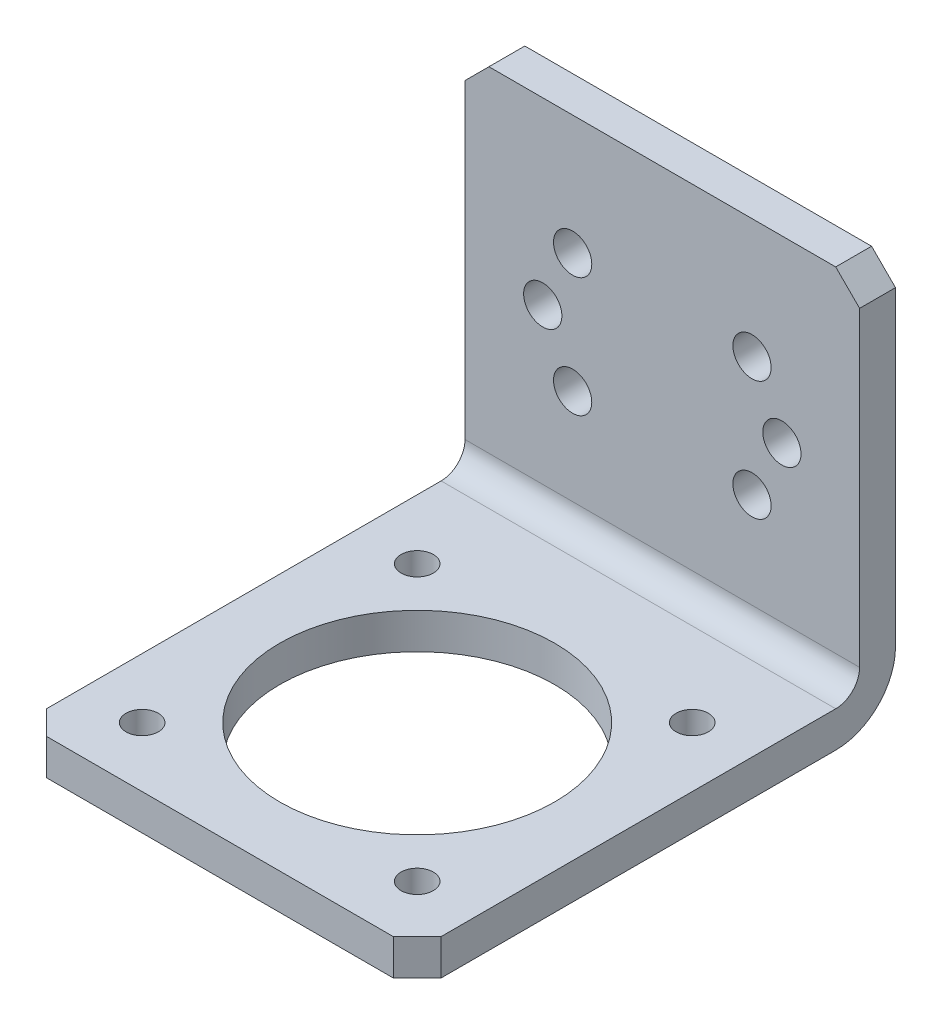
ISO-10303-21;
HEADER;
FILE_DESCRIPTION(('STEP AP214'),'2;1');
FILE_NAME('part.step','',(''),(''),'','','');
FILE_SCHEMA(('AUTOMOTIVE_DESIGN { 1 0 10303 214 1 1 1 1 }'));
ENDSEC;
DATA;
#1=APPLICATION_CONTEXT('core data for automotive mechanical design processes');
#2=APPLICATION_PROTOCOL_DEFINITION('international standard','automotive_design',2000,#1);
#3=PRODUCT_CONTEXT('',#1,'mechanical');
#4=PRODUCT('Part','Part','',(#3));
#5=PRODUCT_RELATED_PRODUCT_CATEGORY('part','',(#4));
#6=PRODUCT_DEFINITION_FORMATION('','',#4);
#7=PRODUCT_DEFINITION_CONTEXT('part definition',#1,'design');
#8=PRODUCT_DEFINITION('design','',#6,#7);
#9=PRODUCT_DEFINITION_SHAPE('','',#8);
#10=(LENGTH_UNIT() NAMED_UNIT(*) SI_UNIT(.MILLI.,.METRE.));
#11=(NAMED_UNIT(*) PLANE_ANGLE_UNIT() SI_UNIT($,.RADIAN.));
#12=(NAMED_UNIT(*) SI_UNIT($,.STERADIAN.) SOLID_ANGLE_UNIT());
#13=UNCERTAINTY_MEASURE_WITH_UNIT(LENGTH_MEASURE(1.E-05),#10,'distance_accuracy_value','');
#14=(GEOMETRIC_REPRESENTATION_CONTEXT(3) GLOBAL_UNCERTAINTY_ASSIGNED_CONTEXT((#13)) GLOBAL_UNIT_ASSIGNED_CONTEXT((#10,
#11,#12)) REPRESENTATION_CONTEXT('',''));
#15=CARTESIAN_POINT('',(0.,0.,0.));
#16=DIRECTION('',(0.,0.,1.));
#17=DIRECTION('',(1.,0.,0.));
#18=AXIS2_PLACEMENT_3D('',#15,#16,#17);
#19=CARTESIAN_POINT('',(0.,3.,0.));
#20=DIRECTION('',(0.,-1.,0.));
#21=DIRECTION('',(0.,0.,-1.));
#22=AXIS2_PLACEMENT_3D('',#19,#20,#21);
#23=PLANE('',#22);
#24=CARTESIAN_POINT('',(11.5,3.,11.5));
#25=DIRECTION('',(0.,1.,0.));
#26=DIRECTION('',(0.,0.,1.));
#27=AXIS2_PLACEMENT_3D('',#24,#25,#26);
#28=CIRCLE('',#27,1.35);
#29=CARTESIAN_POINT('',(11.5,3.,12.85));
#30=VERTEX_POINT('',#29);
#31=EDGE_CURVE('E291',#30,#30,#28,.T.);
#32=ORIENTED_EDGE('',*,*,#31,.F.);
#33=EDGE_LOOP('',(#32));
#34=FACE_BOUND('',#33,.T.);
#35=CARTESIAN_POINT('',(11.5,3.,-11.5));
#36=DIRECTION('',(0.,1.,0.));
#37=DIRECTION('',(0.,0.,1.));
#38=AXIS2_PLACEMENT_3D('',#35,#36,#37);
#39=CIRCLE('',#38,1.35);
#40=CARTESIAN_POINT('',(11.5,3.,-10.15));
#41=VERTEX_POINT('',#40);
#42=EDGE_CURVE('E301',#41,#41,#39,.T.);
#43=ORIENTED_EDGE('',*,*,#42,.F.);
#44=EDGE_LOOP('',(#43));
#45=FACE_BOUND('',#44,.T.);
#46=CARTESIAN_POINT('',(-11.5,3.,-11.5));
#47=DIRECTION('',(0.,1.,0.));
#48=DIRECTION('',(0.,0.,1.));
#49=AXIS2_PLACEMENT_3D('',#46,#47,#48);
#50=CIRCLE('',#49,1.35);
#51=CARTESIAN_POINT('',(-11.5,3.,-10.15));
#52=VERTEX_POINT('',#51);
#53=EDGE_CURVE('E309',#52,#52,#50,.T.);
#54=ORIENTED_EDGE('',*,*,#53,.F.);
#55=EDGE_LOOP('',(#54));
#56=FACE_BOUND('',#55,.T.);
#57=CARTESIAN_POINT('',(-11.5,3.,11.5));
#58=DIRECTION('',(0.,1.,0.));
#59=DIRECTION('',(0.,0.,1.));
#60=AXIS2_PLACEMENT_3D('',#57,#58,#59);
#61=CIRCLE('',#60,1.35);
#62=CARTESIAN_POINT('',(-11.5,3.,12.85));
#63=VERTEX_POINT('',#62);
#64=EDGE_CURVE('E317',#63,#63,#61,.T.);
#65=ORIENTED_EDGE('',*,*,#64,.F.);
#66=EDGE_LOOP('',(#65));
#67=FACE_BOUND('',#66,.T.);
#68=CARTESIAN_POINT('',(0.,3.,0.));
#69=DIRECTION('',(0.,1.,0.));
#70=DIRECTION('',(0.,0.,1.));
#71=AXIS2_PLACEMENT_3D('',#68,#69,#70);
#72=CIRCLE('',#71,11.5);
#73=CARTESIAN_POINT('',(0.,3.,11.5));
#74=VERTEX_POINT('',#73);
#75=EDGE_CURVE('E184',#74,#74,#72,.T.);
#76=ORIENTED_EDGE('',*,*,#75,.F.);
#77=EDGE_LOOP('',(#76));
#78=FACE_BOUND('',#77,.T.);
#79=DIRECTION('',(0.,0.,-1.));
#80=VECTOR('',#79,1.);
#81=CARTESIAN_POINT('',(16.5,3.,-23.5));
#82=LINE('',#81,#80);
#83=CARTESIAN_POINT('',(16.5,3.,14.5));
#84=VERTEX_POINT('',#83);
#85=CARTESIAN_POINT('',(16.5,3.,-18.5));
#86=VERTEX_POINT('',#85);
#87=EDGE_CURVE('E177',#84,#86,#82,.T.);
#88=ORIENTED_EDGE('',*,*,#87,.T.);
#89=DIRECTION('',(1.,0.,0.));
#90=VECTOR('',#89,1.);
#91=CARTESIAN_POINT('',(-16.5,3.,-18.5));
#92=LINE('',#91,#90);
#93=CARTESIAN_POINT('',(-16.5,3.,-18.5));
#94=VERTEX_POINT('',#93);
#95=EDGE_CURVE('E144',#86,#94,#92,.F.);
#96=ORIENTED_EDGE('',*,*,#95,.T.);
#97=DIRECTION('',(0.,0.,1.));
#98=VECTOR('',#97,1.);
#99=CARTESIAN_POINT('',(-16.5,3.,14.5));
#100=LINE('',#99,#98);
#101=CARTESIAN_POINT('',(-16.5,3.,14.5));
#102=VERTEX_POINT('',#101);
#103=EDGE_CURVE('E137',#94,#102,#100,.T.);
#104=ORIENTED_EDGE('',*,*,#103,.T.);
#105=DIRECTION('',(0.707106781186548,0.,0.707106781186548));
#106=VECTOR('',#105,1.);
#107=CARTESIAN_POINT('',(-14.5,3.,16.5));
#108=LINE('',#107,#106);
#109=CARTESIAN_POINT('',(-14.5,3.,16.5));
#110=VERTEX_POINT('',#109);
#111=EDGE_CURVE('E141',#102,#110,#108,.T.);
#112=ORIENTED_EDGE('',*,*,#111,.T.);
#113=DIRECTION('',(1.,0.,0.));
#114=VECTOR('',#113,1.);
#115=CARTESIAN_POINT('',(14.5,3.,16.5));
#116=LINE('',#115,#114);
#117=CARTESIAN_POINT('',(14.5,3.,16.5));
#118=VERTEX_POINT('',#117);
#119=EDGE_CURVE('E166',#110,#118,#116,.T.);
#120=ORIENTED_EDGE('',*,*,#119,.T.);
#121=DIRECTION('',(0.707106781186548,0.,-0.707106781186548));
#122=VECTOR('',#121,1.);
#123=CARTESIAN_POINT('',(16.5,3.,14.5));
#124=LINE('',#123,#122);
#125=EDGE_CURVE('E171',#118,#84,#124,.T.);
#126=ORIENTED_EDGE('',*,*,#125,.T.);
#127=EDGE_LOOP('',(#88,#96,#104,#112,#120,#126));
#128=FACE_BOUND('',#127,.T.);
#129=ADVANCED_FACE('F47',(#34,#45,#56,#67,#78,#128),#23,.F.);
#130=CARTESIAN_POINT('',(0.,0.,0.));
#131=DIRECTION('',(0.,-1.,0.));
#132=DIRECTION('',(0.,0.,-1.));
#133=AXIS2_PLACEMENT_3D('',#130,#131,#132);
#134=PLANE('',#133);
#135=CARTESIAN_POINT('',(11.5,0.,-11.5));
#136=DIRECTION('',(0.,1.,0.));
#137=DIRECTION('',(0.,0.,1.));
#138=AXIS2_PLACEMENT_3D('',#135,#136,#137);
#139=CIRCLE('',#138,1.35);
#140=CARTESIAN_POINT('',(11.5,0.,-10.15));
#141=VERTEX_POINT('',#140);
#142=EDGE_CURVE('E299',#141,#141,#139,.T.);
#143=ORIENTED_EDGE('',*,*,#142,.T.);
#144=EDGE_LOOP('',(#143));
#145=FACE_BOUND('',#144,.T.);
#146=CARTESIAN_POINT('',(-11.5,0.,11.5));
#147=DIRECTION('',(0.,1.,0.));
#148=DIRECTION('',(0.,0.,1.));
#149=AXIS2_PLACEMENT_3D('',#146,#147,#148);
#150=CIRCLE('',#149,1.35);
#151=CARTESIAN_POINT('',(-11.5,0.,12.85));
#152=VERTEX_POINT('',#151);
#153=EDGE_CURVE('E313',#152,#152,#150,.T.);
#154=ORIENTED_EDGE('',*,*,#153,.T.);
#155=EDGE_LOOP('',(#154));
#156=FACE_BOUND('',#155,.T.);
#157=DIRECTION('',(0.,0.,1.));
#158=VECTOR('',#157,1.);
#159=CARTESIAN_POINT('',(-16.5,0.,14.5));
#160=LINE('',#159,#158);
#161=CARTESIAN_POINT('',(-16.5,0.,-18.5));
#162=VERTEX_POINT('',#161);
#163=CARTESIAN_POINT('',(-16.5,0.,14.5));
#164=VERTEX_POINT('',#163);
#165=EDGE_CURVE('E155',#162,#164,#160,.T.);
#166=ORIENTED_EDGE('',*,*,#165,.F.);
#167=DIRECTION('',(-1.,0.,0.));
#168=VECTOR('',#167,1.);
#169=CARTESIAN_POINT('',(16.5,0.,-18.5));
#170=LINE('',#169,#168);
#171=CARTESIAN_POINT('',(16.5,0.,-18.5));
#172=VERTEX_POINT('',#171);
#173=EDGE_CURVE('E227',#162,#172,#170,.F.);
#174=ORIENTED_EDGE('',*,*,#173,.T.);
#175=DIRECTION('',(0.,0.,-1.));
#176=VECTOR('',#175,1.);
#177=CARTESIAN_POINT('',(16.5,0.,-23.5));
#178=LINE('',#177,#176);
#179=CARTESIAN_POINT('',(16.5,0.,14.5));
#180=VERTEX_POINT('',#179);
#181=EDGE_CURVE('E149',#180,#172,#178,.T.);
#182=ORIENTED_EDGE('',*,*,#181,.F.);
#183=DIRECTION('',(0.707106781186548,0.,-0.707106781186548));
#184=VECTOR('',#183,1.);
#185=CARTESIAN_POINT('',(16.5,0.,14.5));
#186=LINE('',#185,#184);
#187=CARTESIAN_POINT('',(14.5,0.,16.5));
#188=VERTEX_POINT('',#187);
#189=EDGE_CURVE('E190',#188,#180,#186,.T.);
#190=ORIENTED_EDGE('',*,*,#189,.F.);
#191=DIRECTION('',(1.,0.,0.));
#192=VECTOR('',#191,1.);
#193=CARTESIAN_POINT('',(14.5,0.,16.5));
#194=LINE('',#193,#192);
#195=CARTESIAN_POINT('',(-14.5,0.,16.5));
#196=VERTEX_POINT('',#195);
#197=EDGE_CURVE('E187',#196,#188,#194,.T.);
#198=ORIENTED_EDGE('',*,*,#197,.F.);
#199=DIRECTION('',(0.707106781186548,0.,0.707106781186548));
#200=VECTOR('',#199,1.);
#201=CARTESIAN_POINT('',(-14.5,0.,16.5));
#202=LINE('',#201,#200);
#203=EDGE_CURVE('E183',#164,#196,#202,.T.);
#204=ORIENTED_EDGE('',*,*,#203,.F.);
#205=EDGE_LOOP('',(#166,#174,#182,#190,#198,#204));
#206=FACE_BOUND('',#205,.T.);
#207=CARTESIAN_POINT('',(0.,0.,0.));
#208=DIRECTION('',(0.,1.,0.));
#209=DIRECTION('',(0.,0.,1.));
#210=AXIS2_PLACEMENT_3D('',#207,#208,#209);
#211=CIRCLE('',#210,11.5);
#212=CARTESIAN_POINT('',(0.,0.,11.5));
#213=VERTEX_POINT('',#212);
#214=EDGE_CURVE('E321',#213,#213,#211,.T.);
#215=ORIENTED_EDGE('',*,*,#214,.T.);
#216=EDGE_LOOP('',(#215));
#217=FACE_BOUND('',#216,.T.);
#218=CARTESIAN_POINT('',(-11.5,0.,-11.5));
#219=DIRECTION('',(0.,1.,0.));
#220=DIRECTION('',(0.,0.,1.));
#221=AXIS2_PLACEMENT_3D('',#218,#219,#220);
#222=CIRCLE('',#221,1.35);
#223=CARTESIAN_POINT('',(-11.5,0.,-10.15));
#224=VERTEX_POINT('',#223);
#225=EDGE_CURVE('E305',#224,#224,#222,.T.);
#226=ORIENTED_EDGE('',*,*,#225,.T.);
#227=EDGE_LOOP('',(#226));
#228=FACE_BOUND('',#227,.T.);
#229=CARTESIAN_POINT('',(11.5,0.,11.5));
#230=DIRECTION('',(0.,1.,0.));
#231=DIRECTION('',(0.,0.,1.));
#232=AXIS2_PLACEMENT_3D('',#229,#230,#231);
#233=CIRCLE('',#232,1.35);
#234=CARTESIAN_POINT('',(11.5,0.,12.85));
#235=VERTEX_POINT('',#234);
#236=EDGE_CURVE('E286',#235,#235,#233,.T.);
#237=ORIENTED_EDGE('',*,*,#236,.T.);
#238=EDGE_LOOP('',(#237));
#239=FACE_BOUND('',#238,.T.);
#240=ADVANCED_FACE('F332',(#145,#156,#206,#217,#228,#239),#134,.T.);
#241=CARTESIAN_POINT('',(-16.5,3.,-23.5));
#242=DIRECTION('',(0.,0.,1.));
#243=DIRECTION('',(1.,0.,0.));
#244=AXIS2_PLACEMENT_3D('',#241,#242,#243);
#245=PLANE('',#244);
#246=CARTESIAN_POINT('',(7.49999999999999,23.,-23.5));
#247=DIRECTION('',(0.,0.,1.));
#248=DIRECTION('',(1.,0.,0.));
#249=AXIS2_PLACEMENT_3D('',#246,#247,#248);
#250=CIRCLE('',#249,1.6);
#251=CARTESIAN_POINT('',(9.1,23.,-23.5));
#252=VERTEX_POINT('',#251);
#253=EDGE_CURVE('E266',#252,#252,#250,.T.);
#254=ORIENTED_EDGE('',*,*,#253,.T.);
#255=EDGE_LOOP('',(#254));
#256=FACE_BOUND('',#255,.T.);
#257=CARTESIAN_POINT('',(7.5,13.,-23.5));
#258=DIRECTION('',(0.,0.,1.));
#259=DIRECTION('',(1.,0.,0.));
#260=AXIS2_PLACEMENT_3D('',#257,#258,#259);
#261=CIRCLE('',#260,1.6);
#262=CARTESIAN_POINT('',(9.1,13.,-23.5));
#263=VERTEX_POINT('',#262);
#264=EDGE_CURVE('E656',#263,#263,#261,.T.);
#265=ORIENTED_EDGE('',*,*,#264,.T.);
#266=EDGE_LOOP('',(#265));
#267=FACE_BOUND('',#266,.T.);
#268=CARTESIAN_POINT('',(-7.5,13.,-23.5));
#269=DIRECTION('',(0.,0.,1.));
#270=DIRECTION('',(1.,0.,0.));
#271=AXIS2_PLACEMENT_3D('',#268,#269,#270);
#272=CIRCLE('',#271,1.6);
#273=CARTESIAN_POINT('',(-5.9,13.,-23.5));
#274=VERTEX_POINT('',#273);
#275=EDGE_CURVE('E652',#274,#274,#272,.T.);
#276=ORIENTED_EDGE('',*,*,#275,.T.);
#277=EDGE_LOOP('',(#276));
#278=FACE_BOUND('',#277,.T.);
#279=CARTESIAN_POINT('',(-10.,18.,-23.5));
#280=DIRECTION('',(0.,0.,1.));
#281=DIRECTION('',(1.,0.,0.));
#282=AXIS2_PLACEMENT_3D('',#279,#280,#281);
#283=CIRCLE('',#282,1.6);
#284=CARTESIAN_POINT('',(-8.4,18.,-23.5));
#285=VERTEX_POINT('',#284);
#286=EDGE_CURVE('E643',#285,#285,#283,.T.);
#287=ORIENTED_EDGE('',*,*,#286,.T.);
#288=EDGE_LOOP('',(#287));
#289=FACE_BOUND('',#288,.T.);
#290=CARTESIAN_POINT('',(10.,18.,-23.5));
#291=DIRECTION('',(0.,0.,1.));
#292=DIRECTION('',(1.,0.,0.));
#293=AXIS2_PLACEMENT_3D('',#290,#291,#292);
#294=CIRCLE('',#293,1.6);
#295=CARTESIAN_POINT('',(11.6,18.,-23.5));
#296=VERTEX_POINT('',#295);
#297=EDGE_CURVE('E638',#296,#296,#294,.T.);
#298=ORIENTED_EDGE('',*,*,#297,.T.);
#299=EDGE_LOOP('',(#298));
#300=FACE_BOUND('',#299,.T.);
#301=CARTESIAN_POINT('',(-7.50000000000001,23.,-23.5));
#302=DIRECTION('',(0.,0.,1.));
#303=DIRECTION('',(1.,0.,0.));
#304=AXIS2_PLACEMENT_3D('',#301,#302,#303);
#305=CIRCLE('',#304,1.6);
#306=CARTESIAN_POINT('',(-5.9,23.,-23.5));
#307=VERTEX_POINT('',#306);
#308=EDGE_CURVE('E635',#307,#307,#305,.T.);
#309=ORIENTED_EDGE('',*,*,#308,.T.);
#310=EDGE_LOOP('',(#309));
#311=FACE_BOUND('',#310,.T.);
#312=DIRECTION('',(-1.,0.,0.));
#313=VECTOR('',#312,1.);
#314=CARTESIAN_POINT('',(0.,33.,-23.5));
#315=LINE('',#314,#313);
#316=CARTESIAN_POINT('',(14.5,33.,-23.5));
#317=VERTEX_POINT('',#316);
#318=CARTESIAN_POINT('',(-14.5,33.,-23.5));
#319=VERTEX_POINT('',#318);
#320=EDGE_CURVE('E265',#317,#319,#315,.T.);
#321=ORIENTED_EDGE('',*,*,#320,.F.);
#322=DIRECTION('',(0.707106781186545,-0.70710678118655,0.));
#323=VECTOR('',#322,1.);
#324=CARTESIAN_POINT('',(14.5,33.,-23.5));
#325=LINE('',#324,#323);
#326=CARTESIAN_POINT('',(16.5,31.,-23.5));
#327=VERTEX_POINT('',#326);
#328=EDGE_CURVE('E245',#317,#327,#325,.T.);
#329=ORIENTED_EDGE('',*,*,#328,.T.);
#330=DIRECTION('',(0.,-1.,0.));
#331=VECTOR('',#330,1.);
#332=CARTESIAN_POINT('',(16.5,3.,-23.5));
#333=LINE('',#332,#331);
#334=CARTESIAN_POINT('',(16.5,5.,-23.5));
#335=VERTEX_POINT('',#334);
#336=EDGE_CURVE('E180',#327,#335,#333,.T.);
#337=ORIENTED_EDGE('',*,*,#336,.T.);
#338=DIRECTION('',(-1.,0.,0.));
#339=VECTOR('',#338,1.);
#340=CARTESIAN_POINT('',(-16.5,5.,-23.5));
#341=LINE('',#340,#339);
#342=CARTESIAN_POINT('',(-16.5,5.,-23.5));
#343=VERTEX_POINT('',#342);
#344=EDGE_CURVE('E221',#335,#343,#341,.T.);
#345=ORIENTED_EDGE('',*,*,#344,.T.);
#346=DIRECTION('',(0.,-1.,0.));
#347=VECTOR('',#346,1.);
#348=CARTESIAN_POINT('',(-16.5,3.,-23.5));
#349=LINE('',#348,#347);
#350=CARTESIAN_POINT('',(-16.5,31.,-23.5));
#351=VERTEX_POINT('',#350);
#352=EDGE_CURVE('E159',#351,#343,#349,.T.);
#353=ORIENTED_EDGE('',*,*,#352,.F.);
#354=DIRECTION('',(0.707106781186546,0.707106781186549,0.));
#355=VECTOR('',#354,1.);
#356=CARTESIAN_POINT('',(-14.5,33.,-23.5));
#357=LINE('',#356,#355);
#358=EDGE_CURVE('E242',#351,#319,#357,.T.);
#359=ORIENTED_EDGE('',*,*,#358,.T.);
#360=EDGE_LOOP('',(#321,#329,#337,#345,#353,#359));
#361=FACE_BOUND('',#360,.T.);
#362=ADVANCED_FACE('F270',(#256,#267,#278,#289,#300,#311,#361),#245,.F.);
#363=CARTESIAN_POINT('',(-16.5,3.,14.5));
#364=DIRECTION('',(1.,0.,0.));
#365=DIRECTION('',(0.,0.,-1.));
#366=AXIS2_PLACEMENT_3D('',#363,#364,#365);
#367=PLANE('',#366);
#368=DIRECTION('',(0.,-1.,0.));
#369=VECTOR('',#368,1.);
#370=CARTESIAN_POINT('',(-16.5,33.,-20.5));
#371=LINE('',#370,#369);
#372=CARTESIAN_POINT('',(-16.5,31.,-20.5));
#373=VERTEX_POINT('',#372);
#374=CARTESIAN_POINT('',(-16.5,5.,-20.5));
#375=VERTEX_POINT('',#374);
#376=EDGE_CURVE('E283',#373,#375,#371,.T.);
#377=ORIENTED_EDGE('',*,*,#376,.F.);
#378=DIRECTION('',(0.,0.,-1.));
#379=VECTOR('',#378,1.);
#380=CARTESIAN_POINT('',(-16.5,31.,-23.5));
#381=LINE('',#380,#379);
#382=EDGE_CURVE('E11',#373,#351,#381,.T.);
#383=ORIENTED_EDGE('',*,*,#382,.T.);
#384=ORIENTED_EDGE('',*,*,#352,.T.);
#385=CARTESIAN_POINT('',(-16.5,5.,-18.5));
#386=DIRECTION('',(1.,0.,0.));
#387=DIRECTION('',(0.,0.,-1.));
#388=AXIS2_PLACEMENT_3D('',#385,#386,#387);
#389=CIRCLE('',#388,5.);
#390=EDGE_CURVE('E224',#343,#162,#389,.F.);
#391=ORIENTED_EDGE('',*,*,#390,.T.);
#392=ORIENTED_EDGE('',*,*,#165,.T.);
#393=DIRECTION('',(0.,-1.,0.));
#394=VECTOR('',#393,1.);
#395=CARTESIAN_POINT('',(-16.5,3.,14.5));
#396=LINE('',#395,#394);
#397=EDGE_CURVE('E152',#102,#164,#396,.T.);
#398=ORIENTED_EDGE('',*,*,#397,.F.);
#399=ORIENTED_EDGE('',*,*,#103,.F.);
#400=CARTESIAN_POINT('',(-16.5,5.,-18.5));
#401=DIRECTION('',(1.,0.,0.));
#402=DIRECTION('',(0.,0.,-1.));
#403=AXIS2_PLACEMENT_3D('',#400,#401,#402);
#404=CIRCLE('',#403,2.);
#405=EDGE_CURVE('E218',#94,#375,#404,.T.);
#406=ORIENTED_EDGE('',*,*,#405,.T.);
#407=EDGE_LOOP('',(#377,#383,#384,#391,#392,#398,#399,#406));
#408=FACE_BOUND('',#407,.T.);
#409=ADVANCED_FACE('F153',(#408),#367,.F.);
#410=CARTESIAN_POINT('',(-14.5,3.,16.5));
#411=DIRECTION('',(0.707106781186547,0.,-0.707106781186547));
#412=DIRECTION('',(-0.707106781186548,0.,-0.707106781186548));
#413=AXIS2_PLACEMENT_3D('',#410,#411,#412);
#414=PLANE('',#413);
#415=ORIENTED_EDGE('',*,*,#203,.T.);
#416=DIRECTION('',(0.,-1.,0.));
#417=VECTOR('',#416,1.);
#418=CARTESIAN_POINT('',(-14.5,3.,16.5));
#419=LINE('',#418,#417);
#420=EDGE_CURVE('E160',#110,#196,#419,.T.);
#421=ORIENTED_EDGE('',*,*,#420,.F.);
#422=ORIENTED_EDGE('',*,*,#111,.F.);
#423=ORIENTED_EDGE('',*,*,#397,.T.);
#424=EDGE_LOOP('',(#415,#421,#422,#423));
#425=FACE_BOUND('',#424,.T.);
#426=ADVANCED_FACE('F162',(#425),#414,.F.);
#427=CARTESIAN_POINT('',(14.5,3.,16.5));
#428=DIRECTION('',(0.,0.,-1.));
#429=DIRECTION('',(-1.,0.,0.));
#430=AXIS2_PLACEMENT_3D('',#427,#428,#429);
#431=PLANE('',#430);
#432=ORIENTED_EDGE('',*,*,#197,.T.);
#433=DIRECTION('',(0.,-1.,0.));
#434=VECTOR('',#433,1.);
#435=CARTESIAN_POINT('',(14.5,3.,16.5));
#436=LINE('',#435,#434);
#437=EDGE_CURVE('E202',#118,#188,#436,.T.);
#438=ORIENTED_EDGE('',*,*,#437,.F.);
#439=ORIENTED_EDGE('',*,*,#119,.F.);
#440=ORIENTED_EDGE('',*,*,#420,.T.);
#441=EDGE_LOOP('',(#432,#438,#439,#440));
#442=FACE_BOUND('',#441,.T.);
#443=ADVANCED_FACE('F360',(#442),#431,.F.);
#444=CARTESIAN_POINT('',(16.5,3.,14.5));
#445=DIRECTION('',(-0.707106781186547,0.,-0.707106781186547));
#446=DIRECTION('',(-0.707106781186548,0.,0.707106781186548));
#447=AXIS2_PLACEMENT_3D('',#444,#445,#446);
#448=PLANE('',#447);
#449=ORIENTED_EDGE('',*,*,#189,.T.);
#450=DIRECTION('',(0.,-1.,0.));
#451=VECTOR('',#450,1.);
#452=CARTESIAN_POINT('',(16.5,3.,14.5));
#453=LINE('',#452,#451);
#454=EDGE_CURVE('E198',#84,#180,#453,.T.);
#455=ORIENTED_EDGE('',*,*,#454,.F.);
#456=ORIENTED_EDGE('',*,*,#125,.F.);
#457=ORIENTED_EDGE('',*,*,#437,.T.);
#458=EDGE_LOOP('',(#449,#455,#456,#457));
#459=FACE_BOUND('',#458,.T.);
#460=ADVANCED_FACE('F346',(#459),#448,.F.);
#461=CARTESIAN_POINT('',(16.5,3.,-23.5));
#462=DIRECTION('',(-1.,0.,0.));
#463=DIRECTION('',(0.,0.,1.));
#464=AXIS2_PLACEMENT_3D('',#461,#462,#463);
#465=PLANE('',#464);
#466=ORIENTED_EDGE('',*,*,#336,.F.);
#467=DIRECTION('',(0.,0.,1.));
#468=VECTOR('',#467,1.);
#469=CARTESIAN_POINT('',(16.5,31.,-20.5));
#470=LINE('',#469,#468);
#471=CARTESIAN_POINT('',(16.5,31.,-20.5));
#472=VERTEX_POINT('',#471);
#473=EDGE_CURVE('E72',#327,#472,#470,.T.);
#474=ORIENTED_EDGE('',*,*,#473,.T.);
#475=DIRECTION('',(0.,-1.,0.));
#476=VECTOR('',#475,1.);
#477=CARTESIAN_POINT('',(16.5,33.,-20.5));
#478=LINE('',#477,#476);
#479=CARTESIAN_POINT('',(16.5,5.,-20.5));
#480=VERTEX_POINT('',#479);
#481=EDGE_CURVE('E256',#472,#480,#478,.T.);
#482=ORIENTED_EDGE('',*,*,#481,.T.);
#483=CARTESIAN_POINT('',(16.5,5.,-18.5));
#484=DIRECTION('',(-1.,0.,0.));
#485=DIRECTION('',(0.,0.,1.));
#486=AXIS2_PLACEMENT_3D('',#483,#484,#485);
#487=CIRCLE('',#486,2.);
#488=EDGE_CURVE('E215',#480,#86,#487,.T.);
#489=ORIENTED_EDGE('',*,*,#488,.T.);
#490=ORIENTED_EDGE('',*,*,#87,.F.);
#491=ORIENTED_EDGE('',*,*,#454,.T.);
#492=ORIENTED_EDGE('',*,*,#181,.T.);
#493=CARTESIAN_POINT('',(16.5,5.,-18.5));
#494=DIRECTION('',(-1.,0.,0.));
#495=DIRECTION('',(0.,0.,1.));
#496=AXIS2_PLACEMENT_3D('',#493,#494,#495);
#497=CIRCLE('',#496,5.);
#498=EDGE_CURVE('E230',#172,#335,#497,.F.);
#499=ORIENTED_EDGE('',*,*,#498,.T.);
#500=EDGE_LOOP('',(#466,#474,#482,#489,#490,#491,#492,#499));
#501=FACE_BOUND('',#500,.T.);
#502=ADVANCED_FACE('F271',(#501),#465,.F.);
#503=CARTESIAN_POINT('',(0.,3.,0.));
#504=DIRECTION('',(0.,-1.,0.));
#505=DIRECTION('',(0.,0.,-1.));
#506=AXIS2_PLACEMENT_3D('',#503,#504,#505);
#507=CYLINDRICAL_SURFACE('',#506,11.5);
#508=ORIENTED_EDGE('',*,*,#75,.T.);
#509=EDGE_LOOP('',(#508));
#510=FACE_BOUND('',#509,.T.);
#511=ORIENTED_EDGE('',*,*,#214,.F.);
#512=EDGE_LOOP('',(#511));
#513=FACE_BOUND('',#512,.T.);
#514=ADVANCED_FACE('F335',(#510,#513),#507,.F.);
#515=CARTESIAN_POINT('',(-11.5,3.,11.5));
#516=DIRECTION('',(0.,-1.,0.));
#517=DIRECTION('',(0.,0.,-1.));
#518=AXIS2_PLACEMENT_3D('',#515,#516,#517);
#519=CYLINDRICAL_SURFACE('',#518,1.35);
#520=ORIENTED_EDGE('',*,*,#64,.T.);
#521=EDGE_LOOP('',(#520));
#522=FACE_BOUND('',#521,.T.);
#523=ORIENTED_EDGE('',*,*,#153,.F.);
#524=EDGE_LOOP('',(#523));
#525=FACE_BOUND('',#524,.T.);
#526=ADVANCED_FACE('F337',(#522,#525),#519,.F.);
#527=CARTESIAN_POINT('',(-11.5,3.,-11.5));
#528=DIRECTION('',(0.,-1.,0.));
#529=DIRECTION('',(0.,0.,-1.));
#530=AXIS2_PLACEMENT_3D('',#527,#528,#529);
#531=CYLINDRICAL_SURFACE('',#530,1.35);
#532=ORIENTED_EDGE('',*,*,#53,.T.);
#533=EDGE_LOOP('',(#532));
#534=FACE_BOUND('',#533,.T.);
#535=ORIENTED_EDGE('',*,*,#225,.F.);
#536=EDGE_LOOP('',(#535));
#537=FACE_BOUND('',#536,.T.);
#538=ADVANCED_FACE('F343',(#534,#537),#531,.F.);
#539=CARTESIAN_POINT('',(11.5,3.,-11.5));
#540=DIRECTION('',(0.,-1.,0.));
#541=DIRECTION('',(0.,0.,-1.));
#542=AXIS2_PLACEMENT_3D('',#539,#540,#541);
#543=CYLINDRICAL_SURFACE('',#542,1.35);
#544=ORIENTED_EDGE('',*,*,#42,.T.);
#545=EDGE_LOOP('',(#544));
#546=FACE_BOUND('',#545,.T.);
#547=ORIENTED_EDGE('',*,*,#142,.F.);
#548=EDGE_LOOP('',(#547));
#549=FACE_BOUND('',#548,.T.);
#550=ADVANCED_FACE('F518',(#546,#549),#543,.F.);
#551=CARTESIAN_POINT('',(11.5,3.,11.5));
#552=DIRECTION('',(0.,-1.,0.));
#553=DIRECTION('',(0.,0.,-1.));
#554=AXIS2_PLACEMENT_3D('',#551,#552,#553);
#555=CYLINDRICAL_SURFACE('',#554,1.35);
#556=ORIENTED_EDGE('',*,*,#31,.T.);
#557=EDGE_LOOP('',(#556));
#558=FACE_BOUND('',#557,.T.);
#559=ORIENTED_EDGE('',*,*,#236,.F.);
#560=EDGE_LOOP('',(#559));
#561=FACE_BOUND('',#560,.T.);
#562=ADVANCED_FACE('F412',(#558,#561),#555,.F.);
#563=CARTESIAN_POINT('',(0.,33.,-20.5));
#564=DIRECTION('',(0.,0.,-1.));
#565=DIRECTION('',(-1.,0.,0.));
#566=AXIS2_PLACEMENT_3D('',#563,#564,#565);
#567=PLANE('',#566);
#568=CARTESIAN_POINT('',(7.49999999999999,23.,-20.5));
#569=DIRECTION('',(0.,0.,1.));
#570=DIRECTION('',(1.,0.,0.));
#571=AXIS2_PLACEMENT_3D('',#568,#569,#570);
#572=CIRCLE('',#571,1.6);
#573=CARTESIAN_POINT('',(9.1,23.,-20.5));
#574=VERTEX_POINT('',#573);
#575=EDGE_CURVE('E645',#574,#574,#572,.T.);
#576=ORIENTED_EDGE('',*,*,#575,.F.);
#577=EDGE_LOOP('',(#576));
#578=FACE_BOUND('',#577,.T.);
#579=CARTESIAN_POINT('',(7.5,13.,-20.5));
#580=DIRECTION('',(0.,0.,1.));
#581=DIRECTION('',(1.,0.,0.));
#582=AXIS2_PLACEMENT_3D('',#579,#580,#581);
#583=CIRCLE('',#582,1.6);
#584=CARTESIAN_POINT('',(9.1,13.,-20.5));
#585=VERTEX_POINT('',#584);
#586=EDGE_CURVE('E679',#585,#585,#583,.T.);
#587=ORIENTED_EDGE('',*,*,#586,.F.);
#588=EDGE_LOOP('',(#587));
#589=FACE_BOUND('',#588,.T.);
#590=CARTESIAN_POINT('',(-7.5,13.,-20.5));
#591=DIRECTION('',(0.,0.,1.));
#592=DIRECTION('',(1.,0.,0.));
#593=AXIS2_PLACEMENT_3D('',#590,#591,#592);
#594=CIRCLE('',#593,1.6);
#595=CARTESIAN_POINT('',(-5.9,13.,-20.5));
#596=VERTEX_POINT('',#595);
#597=EDGE_CURVE('E677',#596,#596,#594,.T.);
#598=ORIENTED_EDGE('',*,*,#597,.F.);
#599=EDGE_LOOP('',(#598));
#600=FACE_BOUND('',#599,.T.);
#601=CARTESIAN_POINT('',(-10.,18.,-20.5));
#602=DIRECTION('',(0.,0.,1.));
#603=DIRECTION('',(1.,0.,0.));
#604=AXIS2_PLACEMENT_3D('',#601,#602,#603);
#605=CIRCLE('',#604,1.6);
#606=CARTESIAN_POINT('',(-8.4,18.,-20.5));
#607=VERTEX_POINT('',#606);
#608=EDGE_CURVE('E689',#607,#607,#605,.T.);
#609=ORIENTED_EDGE('',*,*,#608,.F.);
#610=EDGE_LOOP('',(#609));
#611=FACE_BOUND('',#610,.T.);
#612=CARTESIAN_POINT('',(10.,18.,-20.5));
#613=DIRECTION('',(0.,0.,1.));
#614=DIRECTION('',(1.,0.,0.));
#615=AXIS2_PLACEMENT_3D('',#612,#613,#614);
#616=CIRCLE('',#615,1.6);
#617=CARTESIAN_POINT('',(11.6,18.,-20.5));
#618=VERTEX_POINT('',#617);
#619=EDGE_CURVE('E686',#618,#618,#616,.T.);
#620=ORIENTED_EDGE('',*,*,#619,.F.);
#621=EDGE_LOOP('',(#620));
#622=FACE_BOUND('',#621,.T.);
#623=CARTESIAN_POINT('',(-7.50000000000001,23.,-20.5));
#624=DIRECTION('',(0.,0.,1.));
#625=DIRECTION('',(1.,0.,0.));
#626=AXIS2_PLACEMENT_3D('',#623,#624,#625);
#627=CIRCLE('',#626,1.6);
#628=CARTESIAN_POINT('',(-5.9,23.,-20.5));
#629=VERTEX_POINT('',#628);
#630=EDGE_CURVE('E632',#629,#629,#627,.T.);
#631=ORIENTED_EDGE('',*,*,#630,.F.);
#632=EDGE_LOOP('',(#631));
#633=FACE_BOUND('',#632,.T.);
#634=ORIENTED_EDGE('',*,*,#481,.F.);
#635=DIRECTION('',(-0.707106781186545,0.70710678118655,0.));
#636=VECTOR('',#635,1.);
#637=CARTESIAN_POINT('',(14.5,33.,-20.5));
#638=LINE('',#637,#636);
#639=CARTESIAN_POINT('',(14.5,33.,-20.5));
#640=VERTEX_POINT('',#639);
#641=EDGE_CURVE('E57',#472,#640,#638,.T.);
#642=ORIENTED_EDGE('',*,*,#641,.T.);
#643=DIRECTION('',(1.,0.,0.));
#644=VECTOR('',#643,1.);
#645=CARTESIAN_POINT('',(0.,33.,-20.5));
#646=LINE('',#645,#644);
#647=CARTESIAN_POINT('',(-14.5,33.,-20.5));
#648=VERTEX_POINT('',#647);
#649=EDGE_CURVE('E255',#648,#640,#646,.T.);
#650=ORIENTED_EDGE('',*,*,#649,.F.);
#651=DIRECTION('',(-0.707106781186546,-0.707106781186549,0.));
#652=VECTOR('',#651,1.);
#653=CARTESIAN_POINT('',(-14.5,33.,-20.5));
#654=LINE('',#653,#652);
#655=EDGE_CURVE('E64',#648,#373,#654,.T.);
#656=ORIENTED_EDGE('',*,*,#655,.T.);
#657=ORIENTED_EDGE('',*,*,#376,.T.);
#658=DIRECTION('',(1.,0.,0.));
#659=VECTOR('',#658,1.);
#660=CARTESIAN_POINT('',(16.5,5.,-20.5));
#661=LINE('',#660,#659);
#662=EDGE_CURVE('E209',#375,#480,#661,.T.);
#663=ORIENTED_EDGE('',*,*,#662,.T.);
#664=EDGE_LOOP('',(#634,#642,#650,#656,#657,#663));
#665=FACE_BOUND('',#664,.T.);
#666=ADVANCED_FACE('F254',(#578,#589,#600,#611,#622,#633,#665),#567,.F.);
#667=CARTESIAN_POINT('',(0.,33.,0.));
#668=DIRECTION('',(0.,1.,0.));
#669=DIRECTION('',(0.,0.,1.));
#670=AXIS2_PLACEMENT_3D('',#667,#668,#669);
#671=PLANE('',#670);
#672=ORIENTED_EDGE('',*,*,#649,.T.);
#673=DIRECTION('',(0.,0.,-1.));
#674=VECTOR('',#673,1.);
#675=CARTESIAN_POINT('',(14.5,33.,-23.5));
#676=LINE('',#675,#674);
#677=EDGE_CURVE('E238',#640,#317,#676,.T.);
#678=ORIENTED_EDGE('',*,*,#677,.T.);
#679=ORIENTED_EDGE('',*,*,#320,.T.);
#680=DIRECTION('',(0.,0.,1.));
#681=VECTOR('',#680,1.);
#682=CARTESIAN_POINT('',(-14.5,33.,-20.5));
#683=LINE('',#682,#681);
#684=EDGE_CURVE('E234',#319,#648,#683,.T.);
#685=ORIENTED_EDGE('',*,*,#684,.T.);
#686=EDGE_LOOP('',(#672,#678,#679,#685));
#687=FACE_BOUND('',#686,.T.);
#688=ADVANCED_FACE('F260',(#687),#671,.T.);
#689=CARTESIAN_POINT('',(-7.50000000000001,23.,-25.5));
#690=DIRECTION('',(0.,0.,1.));
#691=DIRECTION('',(1.,0.,0.));
#692=AXIS2_PLACEMENT_3D('',#689,#690,#691);
#693=CYLINDRICAL_SURFACE('',#692,1.6);
#694=ORIENTED_EDGE('',*,*,#630,.T.);
#695=EDGE_LOOP('',(#694));
#696=FACE_BOUND('',#695,.T.);
#697=ORIENTED_EDGE('',*,*,#308,.F.);
#698=EDGE_LOOP('',(#697));
#699=FACE_BOUND('',#698,.T.);
#700=ADVANCED_FACE('F401',(#696,#699),#693,.F.);
#701=CARTESIAN_POINT('',(10.,18.,-25.5));
#702=DIRECTION('',(0.,0.,1.));
#703=DIRECTION('',(1.,0.,0.));
#704=AXIS2_PLACEMENT_3D('',#701,#702,#703);
#705=CYLINDRICAL_SURFACE('',#704,1.6);
#706=ORIENTED_EDGE('',*,*,#619,.T.);
#707=EDGE_LOOP('',(#706));
#708=FACE_BOUND('',#707,.T.);
#709=ORIENTED_EDGE('',*,*,#297,.F.);
#710=EDGE_LOOP('',(#709));
#711=FACE_BOUND('',#710,.T.);
#712=ADVANCED_FACE('F493',(#708,#711),#705,.F.);
#713=CARTESIAN_POINT('',(-10.,18.,-25.5));
#714=DIRECTION('',(0.,0.,1.));
#715=DIRECTION('',(1.,0.,0.));
#716=AXIS2_PLACEMENT_3D('',#713,#714,#715);
#717=CYLINDRICAL_SURFACE('',#716,1.6);
#718=ORIENTED_EDGE('',*,*,#608,.T.);
#719=EDGE_LOOP('',(#718));
#720=FACE_BOUND('',#719,.T.);
#721=ORIENTED_EDGE('',*,*,#286,.F.);
#722=EDGE_LOOP('',(#721));
#723=FACE_BOUND('',#722,.T.);
#724=ADVANCED_FACE('F483',(#720,#723),#717,.F.);
#725=CARTESIAN_POINT('',(-7.5,13.,-25.5));
#726=DIRECTION('',(0.,0.,1.));
#727=DIRECTION('',(1.,0.,0.));
#728=AXIS2_PLACEMENT_3D('',#725,#726,#727);
#729=CYLINDRICAL_SURFACE('',#728,1.6);
#730=ORIENTED_EDGE('',*,*,#597,.T.);
#731=EDGE_LOOP('',(#730));
#732=FACE_BOUND('',#731,.T.);
#733=ORIENTED_EDGE('',*,*,#275,.F.);
#734=EDGE_LOOP('',(#733));
#735=FACE_BOUND('',#734,.T.);
#736=ADVANCED_FACE('F473',(#732,#735),#729,.F.);
#737=CARTESIAN_POINT('',(7.5,13.,-25.5));
#738=DIRECTION('',(0.,0.,1.));
#739=DIRECTION('',(1.,0.,0.));
#740=AXIS2_PLACEMENT_3D('',#737,#738,#739);
#741=CYLINDRICAL_SURFACE('',#740,1.6);
#742=ORIENTED_EDGE('',*,*,#586,.T.);
#743=EDGE_LOOP('',(#742));
#744=FACE_BOUND('',#743,.T.);
#745=ORIENTED_EDGE('',*,*,#264,.F.);
#746=EDGE_LOOP('',(#745));
#747=FACE_BOUND('',#746,.T.);
#748=ADVANCED_FACE('F463',(#744,#747),#741,.F.);
#749=CARTESIAN_POINT('',(7.49999999999999,23.,-25.5));
#750=DIRECTION('',(0.,0.,1.));
#751=DIRECTION('',(1.,0.,0.));
#752=AXIS2_PLACEMENT_3D('',#749,#750,#751);
#753=CYLINDRICAL_SURFACE('',#752,1.6);
#754=ORIENTED_EDGE('',*,*,#575,.T.);
#755=EDGE_LOOP('',(#754));
#756=FACE_BOUND('',#755,.T.);
#757=ORIENTED_EDGE('',*,*,#253,.F.);
#758=EDGE_LOOP('',(#757));
#759=FACE_BOUND('',#758,.T.);
#760=ADVANCED_FACE('F375',(#756,#759),#753,.F.);
#761=CARTESIAN_POINT('',(0.,5.,-18.5));
#762=DIRECTION('',(-1.,0.,0.));
#763=DIRECTION('',(0.,0.,1.));
#764=AXIS2_PLACEMENT_3D('',#761,#762,#763);
#765=CYLINDRICAL_SURFACE('',#764,2.);
#766=ORIENTED_EDGE('',*,*,#405,.F.);
#767=ORIENTED_EDGE('',*,*,#95,.F.);
#768=ORIENTED_EDGE('',*,*,#488,.F.);
#769=ORIENTED_EDGE('',*,*,#662,.F.);
#770=EDGE_LOOP('',(#766,#767,#768,#769));
#771=FACE_BOUND('',#770,.T.);
#772=ADVANCED_FACE('F372',(#771),#765,.F.);
#773=CARTESIAN_POINT('',(-16.5,5.,-18.5));
#774=DIRECTION('',(1.,0.,0.));
#775=DIRECTION('',(0.,0.,-1.));
#776=AXIS2_PLACEMENT_3D('',#773,#774,#775);
#777=CYLINDRICAL_SURFACE('',#776,5.);
#778=ORIENTED_EDGE('',*,*,#498,.F.);
#779=ORIENTED_EDGE('',*,*,#173,.F.);
#780=ORIENTED_EDGE('',*,*,#390,.F.);
#781=ORIENTED_EDGE('',*,*,#344,.F.);
#782=EDGE_LOOP('',(#778,#779,#780,#781));
#783=FACE_BOUND('',#782,.T.);
#784=ADVANCED_FACE('F278',(#783),#777,.T.);
#785=CARTESIAN_POINT('',(14.5,33.,0.));
#786=DIRECTION('',(0.70710678118655,0.707106781186545,0.));
#787=DIRECTION('',(0.,0.,1.));
#788=AXIS2_PLACEMENT_3D('',#785,#786,#787);
#789=PLANE('',#788);
#790=ORIENTED_EDGE('',*,*,#641,.F.);
#791=ORIENTED_EDGE('',*,*,#473,.F.);
#792=ORIENTED_EDGE('',*,*,#328,.F.);
#793=ORIENTED_EDGE('',*,*,#677,.F.);
#794=EDGE_LOOP('',(#790,#791,#792,#793));
#795=FACE_BOUND('',#794,.T.);
#796=ADVANCED_FACE('F268',(#795),#789,.T.);
#797=CARTESIAN_POINT('',(-14.5,33.,0.));
#798=DIRECTION('',(-0.707106781186549,0.707106781186546,0.));
#799=DIRECTION('',(0.,0.,-1.));
#800=AXIS2_PLACEMENT_3D('',#797,#798,#799);
#801=PLANE('',#800);
#802=ORIENTED_EDGE('',*,*,#358,.F.);
#803=ORIENTED_EDGE('',*,*,#382,.F.);
#804=ORIENTED_EDGE('',*,*,#655,.F.);
#805=ORIENTED_EDGE('',*,*,#684,.F.);
#806=EDGE_LOOP('',(#802,#803,#804,#805));
#807=FACE_BOUND('',#806,.T.);
#808=ADVANCED_FACE('F50',(#807),#801,.T.);
#809=CLOSED_SHELL('',(#129,#240,#362,#409,#426,#443,#460,#502,#514,#526,#538,#550,#562,#666,
#688,#700,#712,#724,#736,#748,#760,#772,#784,#796,#808));
#810=MANIFOLD_SOLID_BREP('B2',#809);
#811=ADVANCED_BREP_SHAPE_REPRESENTATION('',(#18,#810),#14);
#812=SHAPE_DEFINITION_REPRESENTATION(#9,#811);
ENDSEC;
END-ISO-10303-21;
